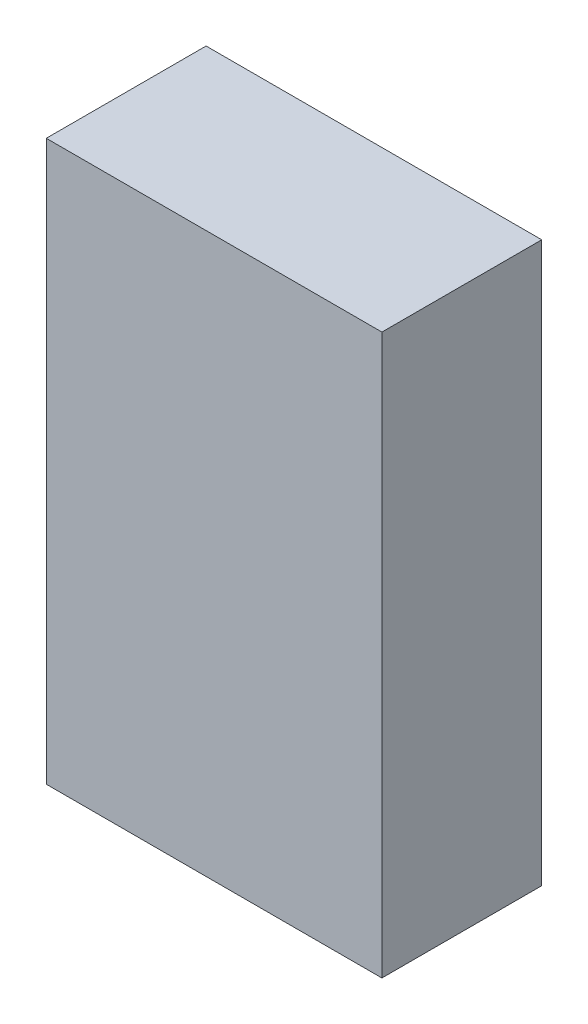
ISO-10303-21;
HEADER;
FILE_DESCRIPTION(('STEP AP214'),'2;1');
FILE_NAME('part.step','',(''),(''),'','','');
FILE_SCHEMA(('AUTOMOTIVE_DESIGN { 1 0 10303 214 1 1 1 1 }'));
ENDSEC;
DATA;
#1=APPLICATION_CONTEXT('core data for automotive mechanical design processes');
#2=APPLICATION_PROTOCOL_DEFINITION('international standard','automotive_design',2000,#1);
#3=PRODUCT_CONTEXT('',#1,'mechanical');
#4=PRODUCT('Part','Part','',(#3));
#5=PRODUCT_RELATED_PRODUCT_CATEGORY('part','',(#4));
#6=PRODUCT_DEFINITION_FORMATION('','',#4);
#7=PRODUCT_DEFINITION_CONTEXT('part definition',#1,'design');
#8=PRODUCT_DEFINITION('design','',#6,#7);
#9=PRODUCT_DEFINITION_SHAPE('','',#8);
#10=(LENGTH_UNIT() NAMED_UNIT(*) SI_UNIT(.MILLI.,.METRE.));
#11=(NAMED_UNIT(*) PLANE_ANGLE_UNIT() SI_UNIT($,.RADIAN.));
#12=(NAMED_UNIT(*) SI_UNIT($,.STERADIAN.) SOLID_ANGLE_UNIT());
#13=UNCERTAINTY_MEASURE_WITH_UNIT(LENGTH_MEASURE(1.E-05),#10,'distance_accuracy_value','');
#14=(GEOMETRIC_REPRESENTATION_CONTEXT(3) GLOBAL_UNCERTAINTY_ASSIGNED_CONTEXT((#13)) GLOBAL_UNIT_ASSIGNED_CONTEXT((#10,
#11,#12)) REPRESENTATION_CONTEXT('',''));
#15=CARTESIAN_POINT('',(0.,0.,0.));
#16=DIRECTION('',(0.,0.,1.));
#17=DIRECTION('',(1.,0.,0.));
#18=AXIS2_PLACEMENT_3D('',#15,#16,#17);
#19=CARTESIAN_POINT('',(0.63000128,1.05000044,0.5999988));
#20=DIRECTION('',(0.,0.,-1.));
#21=DIRECTION('',(-1.,0.,0.));
#22=AXIS2_PLACEMENT_3D('',#19,#20,#21);
#23=PLANE('',#22);
#24=DIRECTION('',(0.,1.,0.));
#25=VECTOR('',#24,1.);
#26=CARTESIAN_POINT('',(-0.62999874,1.05000044,0.5999988));
#27=LINE('',#26,#25);
#28=CARTESIAN_POINT('',(-0.62999874,1.05000044,0.5999988));
#29=VERTEX_POINT('',#28);
#30=CARTESIAN_POINT('',(-0.62999874,-1.05000044,0.5999988));
#31=VERTEX_POINT('',#30);
#32=EDGE_CURVE('E54',#29,#31,#27,.F.);
#33=ORIENTED_EDGE('',*,*,#32,.T.);
#34=DIRECTION('',(1.,0.,0.));
#35=VECTOR('',#34,1.);
#36=CARTESIAN_POINT('',(-0.62999874,-1.05000044,0.5999988));
#37=LINE('',#36,#35);
#38=CARTESIAN_POINT('',(0.63000128,-1.05000044,0.5999988));
#39=VERTEX_POINT('',#38);
#40=EDGE_CURVE('E57',#31,#39,#37,.T.);
#41=ORIENTED_EDGE('',*,*,#40,.T.);
#42=DIRECTION('',(0.,1.,0.));
#43=VECTOR('',#42,1.);
#44=CARTESIAN_POINT('',(0.63000128,-1.05000044,0.5999988));
#45=LINE('',#44,#43);
#46=CARTESIAN_POINT('',(0.63000128,1.05000044,0.5999988));
#47=VERTEX_POINT('',#46);
#48=EDGE_CURVE('E59',#39,#47,#45,.T.);
#49=ORIENTED_EDGE('',*,*,#48,.T.);
#50=DIRECTION('',(-1.,0.,0.));
#51=VECTOR('',#50,1.);
#52=CARTESIAN_POINT('',(0.63000128,1.05000044,0.5999988));
#53=LINE('',#52,#51);
#54=EDGE_CURVE('E19',#29,#47,#53,.F.);
#55=ORIENTED_EDGE('',*,*,#54,.F.);
#56=EDGE_LOOP('',(#33,#41,#49,#55));
#57=FACE_BOUND('',#56,.T.);
#58=ADVANCED_FACE('F16',(#57),#23,.F.);
#59=CARTESIAN_POINT('',(0.63000128,-1.05000044,0.));
#60=DIRECTION('',(-1.,0.,0.));
#61=DIRECTION('',(0.,0.,1.));
#62=AXIS2_PLACEMENT_3D('',#59,#60,#61);
#63=PLANE('',#62);
#64=DIRECTION('',(0.,0.,-1.));
#65=VECTOR('',#64,1.);
#66=CARTESIAN_POINT('',(0.63000128,1.05000044,0.));
#67=LINE('',#66,#65);
#68=CARTESIAN_POINT('',(0.63000128,1.05000044,0.));
#69=VERTEX_POINT('',#68);
#70=EDGE_CURVE('E70',#69,#47,#67,.F.);
#71=ORIENTED_EDGE('',*,*,#70,.T.);
#72=ORIENTED_EDGE('',*,*,#48,.F.);
#73=DIRECTION('',(0.,0.,1.));
#74=VECTOR('',#73,1.);
#75=CARTESIAN_POINT('',(0.63000128,-1.05000044,0.));
#76=LINE('',#75,#74);
#77=CARTESIAN_POINT('',(0.63000128,-1.05000044,0.));
#78=VERTEX_POINT('',#77);
#79=EDGE_CURVE('E64',#39,#78,#76,.F.);
#80=ORIENTED_EDGE('',*,*,#79,.T.);
#81=DIRECTION('',(0.,1.,0.));
#82=VECTOR('',#81,1.);
#83=CARTESIAN_POINT('',(0.63000128,1.05000044,0.));
#84=LINE('',#83,#82);
#85=EDGE_CURVE('E82',#69,#78,#84,.F.);
#86=ORIENTED_EDGE('',*,*,#85,.F.);
#87=EDGE_LOOP('',(#71,#72,#80,#86));
#88=FACE_BOUND('',#87,.T.);
#89=ADVANCED_FACE('F67',(#88),#63,.F.);
#90=CARTESIAN_POINT('',(-0.62999874,-1.05000044,0.));
#91=DIRECTION('',(0.,1.,0.));
#92=DIRECTION('',(0.,0.,1.));
#93=AXIS2_PLACEMENT_3D('',#90,#91,#92);
#94=PLANE('',#93);
#95=ORIENTED_EDGE('',*,*,#79,.F.);
#96=ORIENTED_EDGE('',*,*,#40,.F.);
#97=DIRECTION('',(0.,0.,-1.));
#98=VECTOR('',#97,1.);
#99=CARTESIAN_POINT('',(-0.62999874,-1.05000044,0.));
#100=LINE('',#99,#98);
#101=CARTESIAN_POINT('',(-0.62999874,-1.05000044,0.));
#102=VERTEX_POINT('',#101);
#103=EDGE_CURVE('E76',#31,#102,#100,.T.);
#104=ORIENTED_EDGE('',*,*,#103,.T.);
#105=DIRECTION('',(-1.,0.,0.));
#106=VECTOR('',#105,1.);
#107=CARTESIAN_POINT('',(0.63000128,-1.05000044,0.));
#108=LINE('',#107,#106);
#109=EDGE_CURVE('E73',#78,#102,#108,.T.);
#110=ORIENTED_EDGE('',*,*,#109,.F.);
#111=EDGE_LOOP('',(#95,#96,#104,#110));
#112=FACE_BOUND('',#111,.T.);
#113=ADVANCED_FACE('F71',(#112),#94,.F.);
#114=CARTESIAN_POINT('',(-0.62999874,1.05000044,0.));
#115=DIRECTION('',(1.,0.,0.));
#116=DIRECTION('',(0.,0.,-1.));
#117=AXIS2_PLACEMENT_3D('',#114,#115,#116);
#118=PLANE('',#117);
#119=ORIENTED_EDGE('',*,*,#103,.F.);
#120=ORIENTED_EDGE('',*,*,#32,.F.);
#121=DIRECTION('',(0.,0.,-1.));
#122=VECTOR('',#121,1.);
#123=CARTESIAN_POINT('',(-0.62999874,1.05000044,0.));
#124=LINE('',#123,#122);
#125=CARTESIAN_POINT('',(-0.62999874,1.05000044,0.));
#126=VERTEX_POINT('',#125);
#127=EDGE_CURVE('E34',#29,#126,#124,.T.);
#128=ORIENTED_EDGE('',*,*,#127,.T.);
#129=DIRECTION('',(0.,1.,0.));
#130=VECTOR('',#129,1.);
#131=CARTESIAN_POINT('',(-0.62999874,1.05000044,0.));
#132=LINE('',#131,#130);
#133=EDGE_CURVE('E25',#102,#126,#132,.T.);
#134=ORIENTED_EDGE('',*,*,#133,.F.);
#135=EDGE_LOOP('',(#119,#120,#128,#134));
#136=FACE_BOUND('',#135,.T.);
#137=ADVANCED_FACE('F88',(#136),#118,.F.);
#138=CARTESIAN_POINT('',(0.63000128,1.05000044,0.));
#139=DIRECTION('',(0.,-1.,0.));
#140=DIRECTION('',(0.,0.,-1.));
#141=AXIS2_PLACEMENT_3D('',#138,#139,#140);
#142=PLANE('',#141);
#143=ORIENTED_EDGE('',*,*,#127,.F.);
#144=ORIENTED_EDGE('',*,*,#54,.T.);
#145=ORIENTED_EDGE('',*,*,#70,.F.);
#146=DIRECTION('',(-1.,0.,0.));
#147=VECTOR('',#146,1.);
#148=CARTESIAN_POINT('',(0.63000128,1.05000044,0.));
#149=LINE('',#148,#147);
#150=EDGE_CURVE('E11',#126,#69,#149,.F.);
#151=ORIENTED_EDGE('',*,*,#150,.F.);
#152=EDGE_LOOP('',(#143,#144,#145,#151));
#153=FACE_BOUND('',#152,.T.);
#154=ADVANCED_FACE('F90',(#153),#142,.F.);
#155=CARTESIAN_POINT('',(0.63000128,1.05000044,0.));
#156=DIRECTION('',(0.,0.,-1.));
#157=DIRECTION('',(-1.,0.,0.));
#158=AXIS2_PLACEMENT_3D('',#155,#156,#157);
#159=PLANE('',#158);
#160=ORIENTED_EDGE('',*,*,#133,.T.);
#161=ORIENTED_EDGE('',*,*,#150,.T.);
#162=ORIENTED_EDGE('',*,*,#85,.T.);
#163=ORIENTED_EDGE('',*,*,#109,.T.);
#164=EDGE_LOOP('',(#160,#161,#162,#163));
#165=FACE_BOUND('',#164,.T.);
#166=ADVANCED_FACE('F87',(#165),#159,.T.);
#167=CLOSED_SHELL('',(#58,#89,#113,#137,#154,#166));
#168=MANIFOLD_SOLID_BREP('B1',#167);
#169=ADVANCED_BREP_SHAPE_REPRESENTATION('',(#18,#168),#14);
#170=SHAPE_DEFINITION_REPRESENTATION(#9,#169);
ENDSEC;
END-ISO-10303-21;
